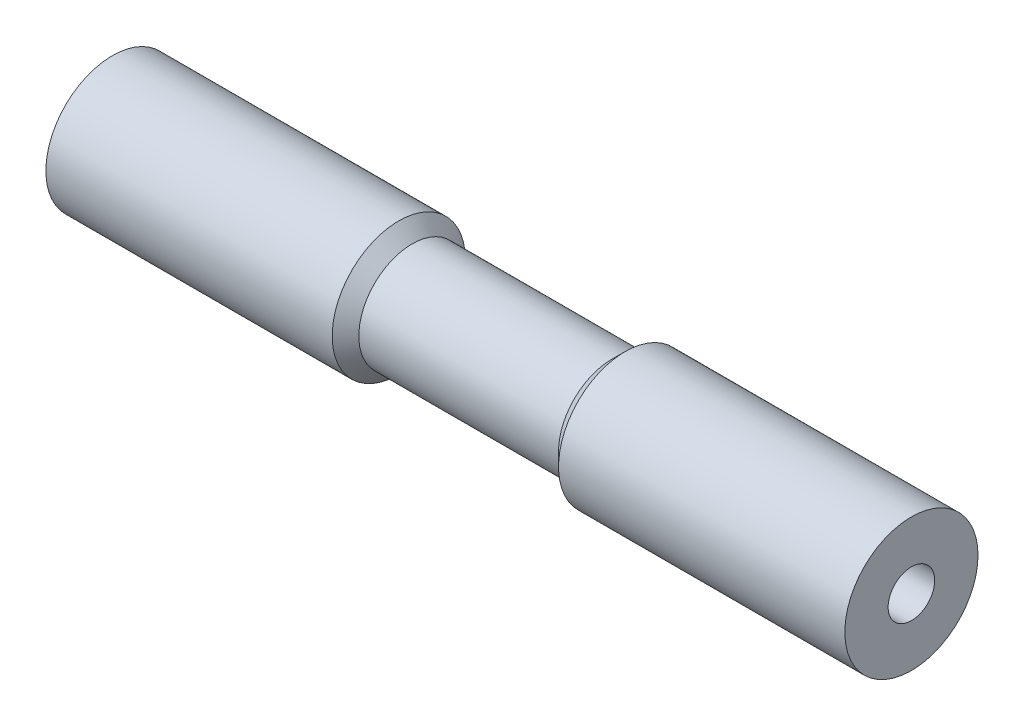
ISO-10303-21;
HEADER;
FILE_DESCRIPTION(('STEP AP214'),'2;1');
FILE_NAME('part.step','',(''),(''),'','','');
FILE_SCHEMA(('AUTOMOTIVE_DESIGN { 1 0 10303 214 1 1 1 1 }'));
ENDSEC;
DATA;
#1=APPLICATION_CONTEXT('core data for automotive mechanical design processes');
#2=APPLICATION_PROTOCOL_DEFINITION('international standard','automotive_design',2000,#1);
#3=PRODUCT_CONTEXT('',#1,'mechanical');
#4=PRODUCT('Part','Part','',(#3));
#5=PRODUCT_RELATED_PRODUCT_CATEGORY('part','',(#4));
#6=PRODUCT_DEFINITION_FORMATION('','',#4);
#7=PRODUCT_DEFINITION_CONTEXT('part definition',#1,'design');
#8=PRODUCT_DEFINITION('design','',#6,#7);
#9=PRODUCT_DEFINITION_SHAPE('','',#8);
#10=(LENGTH_UNIT() NAMED_UNIT(*) SI_UNIT(.MILLI.,.METRE.));
#11=(NAMED_UNIT(*) PLANE_ANGLE_UNIT() SI_UNIT($,.RADIAN.));
#12=(NAMED_UNIT(*) SI_UNIT($,.STERADIAN.) SOLID_ANGLE_UNIT());
#13=UNCERTAINTY_MEASURE_WITH_UNIT(LENGTH_MEASURE(1.E-05),#10,'distance_accuracy_value','');
#14=(GEOMETRIC_REPRESENTATION_CONTEXT(3) GLOBAL_UNCERTAINTY_ASSIGNED_CONTEXT((#13)) GLOBAL_UNIT_ASSIGNED_CONTEXT((#10,
#11,#12)) REPRESENTATION_CONTEXT('',''));
#15=CARTESIAN_POINT('',(0.,0.,0.));
#16=DIRECTION('',(0.,0.,1.));
#17=DIRECTION('',(1.,0.,0.));
#18=AXIS2_PLACEMENT_3D('',#15,#16,#17);
#19=CARTESIAN_POINT('',(120.,0.,0.));
#20=DIRECTION('',(1.,0.,0.));
#21=DIRECTION('',(0.,0.,-1.));
#22=AXIS2_PLACEMENT_3D('',#19,#20,#21);
#23=CYLINDRICAL_SURFACE('',#22,10.);
#24=CARTESIAN_POINT('',(0.,0.,0.));
#25=DIRECTION('',(1.,0.,0.));
#26=DIRECTION('',(0.,0.,-1.));
#27=AXIS2_PLACEMENT_3D('',#24,#25,#26);
#28=CIRCLE('',#27,10.);
#29=CARTESIAN_POINT('',(0.,0.,-10.));
#30=VERTEX_POINT('',#29);
#31=EDGE_CURVE('E75',#30,#30,#28,.T.);
#32=ORIENTED_EDGE('',*,*,#31,.T.);
#33=EDGE_LOOP('',(#32));
#34=FACE_BOUND('',#33,.T.);
#35=CARTESIAN_POINT('',(43.,0.,0.));
#36=DIRECTION('',(1.,0.,0.));
#37=DIRECTION('',(0.,0.,-1.));
#38=AXIS2_PLACEMENT_3D('',#35,#36,#37);
#39=CIRCLE('',#38,10.);
#40=CARTESIAN_POINT('',(43.,0.,-10.));
#41=VERTEX_POINT('',#40);
#42=EDGE_CURVE('E11',#41,#41,#39,.T.);
#43=ORIENTED_EDGE('',*,*,#42,.F.);
#44=EDGE_LOOP('',(#43));
#45=FACE_BOUND('',#44,.T.);
#46=ADVANCED_FACE('F43',(#34,#45),#23,.T.);
#47=CARTESIAN_POINT('',(45.,0.,0.));
#48=DIRECTION('',(-1.,0.,0.));
#49=DIRECTION('',(0.,0.,1.));
#50=AXIS2_PLACEMENT_3D('',#47,#48,#49);
#51=CONICAL_SURFACE('',#50,7.99999999999999,0.78539816339745);
#52=ORIENTED_EDGE('',*,*,#42,.T.);
#53=EDGE_LOOP('',(#52));
#54=FACE_BOUND('',#53,.T.);
#55=CARTESIAN_POINT('',(45.,0.,0.));
#56=DIRECTION('',(1.,0.,0.));
#57=DIRECTION('',(0.,0.,-1.));
#58=AXIS2_PLACEMENT_3D('',#55,#56,#57);
#59=CIRCLE('',#58,7.99999999999999);
#60=CARTESIAN_POINT('',(45.,0.,-7.99999999999999));
#61=VERTEX_POINT('',#60);
#62=EDGE_CURVE('E51',#61,#61,#59,.T.);
#63=ORIENTED_EDGE('',*,*,#62,.F.);
#64=EDGE_LOOP('',(#63));
#65=FACE_BOUND('',#64,.T.);
#66=ADVANCED_FACE('F120',(#54,#65),#51,.T.);
#67=CARTESIAN_POINT('',(120.,0.,0.));
#68=DIRECTION('',(1.,0.,0.));
#69=DIRECTION('',(0.,0.,-1.));
#70=AXIS2_PLACEMENT_3D('',#67,#68,#69);
#71=CYLINDRICAL_SURFACE('',#70,7.99999999999999);
#72=ORIENTED_EDGE('',*,*,#62,.T.);
#73=EDGE_LOOP('',(#72));
#74=FACE_BOUND('',#73,.T.);
#75=CARTESIAN_POINT('',(75.,0.,0.));
#76=DIRECTION('',(1.,0.,0.));
#77=DIRECTION('',(0.,0.,-1.));
#78=AXIS2_PLACEMENT_3D('',#75,#76,#77);
#79=CIRCLE('',#78,8.);
#80=CARTESIAN_POINT('',(75.,0.,-8.));
#81=VERTEX_POINT('',#80);
#82=EDGE_CURVE('E110',#81,#81,#79,.T.);
#83=ORIENTED_EDGE('',*,*,#82,.F.);
#84=EDGE_LOOP('',(#83));
#85=FACE_BOUND('',#84,.T.);
#86=ADVANCED_FACE('F117',(#74,#85),#71,.T.);
#87=CARTESIAN_POINT('',(77.,0.,0.));
#88=DIRECTION('',(1.,0.,0.));
#89=DIRECTION('',(0.,0.,-1.));
#90=AXIS2_PLACEMENT_3D('',#87,#88,#89);
#91=CONICAL_SURFACE('',#90,10.,0.785398163397449);
#92=ORIENTED_EDGE('',*,*,#82,.T.);
#93=EDGE_LOOP('',(#92));
#94=FACE_BOUND('',#93,.T.);
#95=CARTESIAN_POINT('',(77.,0.,0.));
#96=DIRECTION('',(1.,0.,0.));
#97=DIRECTION('',(0.,0.,-1.));
#98=AXIS2_PLACEMENT_3D('',#95,#96,#97);
#99=CIRCLE('',#98,10.);
#100=CARTESIAN_POINT('',(77.,0.,-10.));
#101=VERTEX_POINT('',#100);
#102=EDGE_CURVE('E106',#101,#101,#99,.T.);
#103=ORIENTED_EDGE('',*,*,#102,.F.);
#104=EDGE_LOOP('',(#103));
#105=FACE_BOUND('',#104,.T.);
#106=ADVANCED_FACE('F127',(#94,#105),#91,.T.);
#107=CARTESIAN_POINT('',(120.,0.,0.));
#108=DIRECTION('',(1.,0.,0.));
#109=DIRECTION('',(0.,0.,-1.));
#110=AXIS2_PLACEMENT_3D('',#107,#108,#109);
#111=CYLINDRICAL_SURFACE('',#110,10.);
#112=ORIENTED_EDGE('',*,*,#102,.T.);
#113=EDGE_LOOP('',(#112));
#114=FACE_BOUND('',#113,.T.);
#115=CARTESIAN_POINT('',(120.,0.,0.));
#116=DIRECTION('',(1.,0.,0.));
#117=DIRECTION('',(0.,0.,-1.));
#118=AXIS2_PLACEMENT_3D('',#115,#116,#117);
#119=CIRCLE('',#118,10.);
#120=CARTESIAN_POINT('',(120.,0.,-10.));
#121=VERTEX_POINT('',#120);
#122=EDGE_CURVE('E102',#121,#121,#119,.T.);
#123=ORIENTED_EDGE('',*,*,#122,.F.);
#124=EDGE_LOOP('',(#123));
#125=FACE_BOUND('',#124,.T.);
#126=ADVANCED_FACE('F133',(#114,#125),#111,.T.);
#127=CARTESIAN_POINT('',(120.,0.,0.));
#128=DIRECTION('',(1.,0.,0.));
#129=DIRECTION('',(0.,0.,-1.));
#130=AXIS2_PLACEMENT_3D('',#127,#128,#129);
#131=PLANE('',#130);
#132=CARTESIAN_POINT('',(120.,0.,0.));
#133=DIRECTION('',(1.,0.,0.));
#134=DIRECTION('',(0.,0.,-1.));
#135=AXIS2_PLACEMENT_3D('',#132,#133,#134);
#136=CIRCLE('',#135,3.5);
#137=CARTESIAN_POINT('',(120.,0.,-3.5));
#138=VERTEX_POINT('',#137);
#139=EDGE_CURVE('E91',#138,#138,#136,.T.);
#140=ORIENTED_EDGE('',*,*,#139,.F.);
#141=EDGE_LOOP('',(#140));
#142=FACE_BOUND('',#141,.T.);
#143=ORIENTED_EDGE('',*,*,#122,.T.);
#144=EDGE_LOOP('',(#143));
#145=FACE_BOUND('',#144,.T.);
#146=ADVANCED_FACE('F137',(#142,#145),#131,.T.);
#147=CARTESIAN_POINT('',(0.,0.,0.));
#148=DIRECTION('',(-1.,0.,0.));
#149=DIRECTION('',(0.,0.,1.));
#150=AXIS2_PLACEMENT_3D('',#147,#148,#149);
#151=PLANE('',#150);
#152=CARTESIAN_POINT('',(0.,0.,0.));
#153=DIRECTION('',(-1.,0.,0.));
#154=DIRECTION('',(0.,0.,1.));
#155=AXIS2_PLACEMENT_3D('',#152,#153,#154);
#156=CIRCLE('',#155,1.65);
#157=CARTESIAN_POINT('',(0.,1.15,-1.18321595661992));
#158=VERTEX_POINT('',#157);
#159=CARTESIAN_POINT('',(0.,1.15,1.18321595661992));
#160=VERTEX_POINT('',#159);
#161=EDGE_CURVE('E58',#158,#160,#156,.T.);
#162=ORIENTED_EDGE('',*,*,#161,.F.);
#163=DIRECTION('',(0.,0.,-1.));
#164=VECTOR('',#163,1.);
#165=CARTESIAN_POINT('',(0.,1.15,-1.18321595661992));
#166=LINE('',#165,#164);
#167=EDGE_CURVE('E79',#160,#158,#166,.T.);
#168=ORIENTED_EDGE('',*,*,#167,.F.);
#169=EDGE_LOOP('',(#162,#168));
#170=FACE_BOUND('',#169,.T.);
#171=ORIENTED_EDGE('',*,*,#31,.F.);
#172=EDGE_LOOP('',(#171));
#173=FACE_BOUND('',#172,.T.);
#174=ADVANCED_FACE('F84',(#170,#173),#151,.T.);
#175=CARTESIAN_POINT('',(20.,0.,0.));
#176=DIRECTION('',(-1.,0.,0.));
#177=DIRECTION('',(0.,0.,1.));
#178=AXIS2_PLACEMENT_3D('',#175,#176,#177);
#179=CYLINDRICAL_SURFACE('',#178,1.65);
#180=ORIENTED_EDGE('',*,*,#161,.T.);
#181=DIRECTION('',(-1.,0.,0.));
#182=VECTOR('',#181,1.);
#183=CARTESIAN_POINT('',(20.,1.15,1.18321595661992));
#184=LINE('',#183,#182);
#185=CARTESIAN_POINT('',(20.,1.15,1.18321595661992));
#186=VERTEX_POINT('',#185);
#187=EDGE_CURVE('E76',#186,#160,#184,.T.);
#188=ORIENTED_EDGE('',*,*,#187,.F.);
#189=CARTESIAN_POINT('',(20.,0.,0.));
#190=DIRECTION('',(-1.,0.,0.));
#191=DIRECTION('',(0.,0.,1.));
#192=AXIS2_PLACEMENT_3D('',#189,#190,#191);
#193=CIRCLE('',#192,1.65);
#194=CARTESIAN_POINT('',(20.,1.15,-1.18321595661992));
#195=VERTEX_POINT('',#194);
#196=EDGE_CURVE('E72',#195,#186,#193,.T.);
#197=ORIENTED_EDGE('',*,*,#196,.F.);
#198=DIRECTION('',(-1.,0.,0.));
#199=VECTOR('',#198,1.);
#200=CARTESIAN_POINT('',(20.,1.15,-1.18321595661992));
#201=LINE('',#200,#199);
#202=EDGE_CURVE('E66',#195,#158,#201,.T.);
#203=ORIENTED_EDGE('',*,*,#202,.T.);
#204=EDGE_LOOP('',(#180,#188,#197,#203));
#205=FACE_BOUND('',#204,.T.);
#206=ADVANCED_FACE('F70',(#205),#179,.F.);
#207=CARTESIAN_POINT('',(20.,1.15,-1.18321595661992));
#208=DIRECTION('',(0.,1.,0.));
#209=DIRECTION('',(0.,0.,1.));
#210=AXIS2_PLACEMENT_3D('',#207,#208,#209);
#211=PLANE('',#210);
#212=ORIENTED_EDGE('',*,*,#167,.T.);
#213=ORIENTED_EDGE('',*,*,#202,.F.);
#214=DIRECTION('',(0.,0.,-1.));
#215=VECTOR('',#214,1.);
#216=CARTESIAN_POINT('',(20.,1.15,-1.18321595661992));
#217=LINE('',#216,#215);
#218=EDGE_CURVE('E94',#186,#195,#217,.T.);
#219=ORIENTED_EDGE('',*,*,#218,.F.);
#220=ORIENTED_EDGE('',*,*,#187,.T.);
#221=EDGE_LOOP('',(#212,#213,#219,#220));
#222=FACE_BOUND('',#221,.T.);
#223=ADVANCED_FACE('F80',(#222),#211,.F.);
#224=CARTESIAN_POINT('',(20.,0.,0.));
#225=DIRECTION('',(-1.,0.,0.));
#226=DIRECTION('',(0.,0.,1.));
#227=AXIS2_PLACEMENT_3D('',#224,#225,#226);
#228=PLANE('',#227);
#229=ORIENTED_EDGE('',*,*,#196,.T.);
#230=ORIENTED_EDGE('',*,*,#218,.T.);
#231=EDGE_LOOP('',(#229,#230));
#232=FACE_BOUND('',#231,.T.);
#233=ADVANCED_FACE('F148',(#232),#228,.T.);
#234=CARTESIAN_POINT('',(70.,0.,0.));
#235=DIRECTION('',(1.,0.,0.));
#236=DIRECTION('',(0.,0.,-1.));
#237=AXIS2_PLACEMENT_3D('',#234,#235,#236);
#238=CYLINDRICAL_SURFACE('',#237,3.5);
#239=CARTESIAN_POINT('',(70.,0.,0.));
#240=DIRECTION('',(1.,0.,0.));
#241=DIRECTION('',(0.,0.,-1.));
#242=AXIS2_PLACEMENT_3D('',#239,#240,#241);
#243=CIRCLE('',#242,3.5);
#244=CARTESIAN_POINT('',(70.,0.,-3.5));
#245=VERTEX_POINT('',#244);
#246=EDGE_CURVE('E87',#245,#245,#243,.T.);
#247=ORIENTED_EDGE('',*,*,#246,.F.);
#248=EDGE_LOOP('',(#247));
#249=FACE_BOUND('',#248,.T.);
#250=ORIENTED_EDGE('',*,*,#139,.T.);
#251=EDGE_LOOP('',(#250));
#252=FACE_BOUND('',#251,.T.);
#253=ADVANCED_FACE('F151',(#249,#252),#238,.F.);
#254=CARTESIAN_POINT('',(70.,0.,0.));
#255=DIRECTION('',(1.,0.,0.));
#256=DIRECTION('',(0.,0.,-1.));
#257=AXIS2_PLACEMENT_3D('',#254,#255,#256);
#258=PLANE('',#257);
#259=ORIENTED_EDGE('',*,*,#246,.T.);
#260=EDGE_LOOP('',(#259));
#261=FACE_BOUND('',#260,.T.);
#262=ADVANCED_FACE('F155',(#261),#258,.T.);
#263=CLOSED_SHELL('',(#46,#66,#86,#106,#126,#146,#174,#206,#223,#233,#253,#262));
#264=MANIFOLD_SOLID_BREP('B2',#263);
#265=ADVANCED_BREP_SHAPE_REPRESENTATION('',(#18,#264),#14);
#266=SHAPE_DEFINITION_REPRESENTATION(#9,#265);
ENDSEC;
END-ISO-10303-21;
